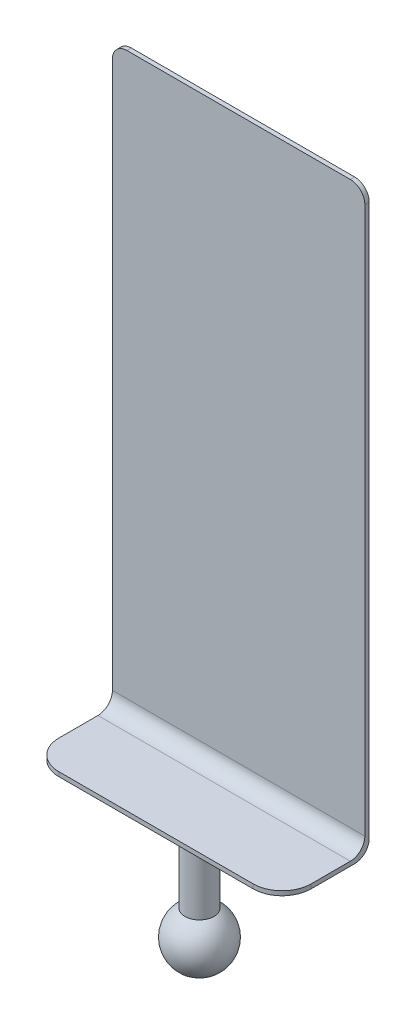
ISO-10303-21;
HEADER;
FILE_DESCRIPTION(('STEP AP214'),'2;1');
FILE_NAME('part.step','',(''),(''),'','','');
FILE_SCHEMA(('AUTOMOTIVE_DESIGN { 1 0 10303 214 1 1 1 1 }'));
ENDSEC;
DATA;
#1=APPLICATION_CONTEXT('core data for automotive mechanical design processes');
#2=APPLICATION_PROTOCOL_DEFINITION('international standard','automotive_design',2000,#1);
#3=PRODUCT_CONTEXT('',#1,'mechanical');
#4=PRODUCT('Part','Part','',(#3));
#5=PRODUCT_RELATED_PRODUCT_CATEGORY('part','',(#4));
#6=PRODUCT_DEFINITION_FORMATION('','',#4);
#7=PRODUCT_DEFINITION_CONTEXT('part definition',#1,'design');
#8=PRODUCT_DEFINITION('design','',#6,#7);
#9=PRODUCT_DEFINITION_SHAPE('','',#8);
#10=(LENGTH_UNIT() NAMED_UNIT(*) SI_UNIT(.MILLI.,.METRE.));
#11=(NAMED_UNIT(*) PLANE_ANGLE_UNIT() SI_UNIT($,.RADIAN.));
#12=(NAMED_UNIT(*) SI_UNIT($,.STERADIAN.) SOLID_ANGLE_UNIT());
#13=UNCERTAINTY_MEASURE_WITH_UNIT(LENGTH_MEASURE(1.E-05),#10,'distance_accuracy_value','');
#14=(GEOMETRIC_REPRESENTATION_CONTEXT(3) GLOBAL_UNCERTAINTY_ASSIGNED_CONTEXT((#13)) GLOBAL_UNIT_ASSIGNED_CONTEXT((#10,
#11,#12)) REPRESENTATION_CONTEXT('',''));
#15=CARTESIAN_POINT('',(0.,0.,0.));
#16=DIRECTION('',(0.,0.,1.));
#17=DIRECTION('',(1.,0.,0.));
#18=AXIS2_PLACEMENT_3D('',#15,#16,#17);
#19=CARTESIAN_POINT('',(43.5,200.,0.749999999999995));
#20=DIRECTION('',(0.,0.,-1.));
#21=DIRECTION('',(-1.,0.,0.));
#22=AXIS2_PLACEMENT_3D('',#19,#20,#21);
#23=PLANE('',#22);
#24=DIRECTION('',(0.,-1.,0.));
#25=VECTOR('',#24,1.);
#26=CARTESIAN_POINT('',(43.5,200.,0.749999999999995));
#27=LINE('',#26,#25);
#28=CARTESIAN_POINT('',(43.5,195.,0.749999999999995));
#29=VERTEX_POINT('',#28);
#30=CARTESIAN_POINT('',(43.5,6.50000000000001,0.749999999999995));
#31=VERTEX_POINT('',#30);
#32=EDGE_CURVE('E166',#29,#31,#27,.T.);
#33=ORIENTED_EDGE('',*,*,#32,.F.);
#34=CARTESIAN_POINT('',(38.5,195.,0.749999999999995));
#35=DIRECTION('',(0.,0.,-1.));
#36=DIRECTION('',(-1.,0.,0.));
#37=AXIS2_PLACEMENT_3D('',#34,#35,#36);
#38=CIRCLE('',#37,5.);
#39=CARTESIAN_POINT('',(38.5,200.,0.749999999999995));
#40=VERTEX_POINT('',#39);
#41=EDGE_CURVE('E219',#29,#40,#38,.F.);
#42=ORIENTED_EDGE('',*,*,#41,.T.);
#43=DIRECTION('',(1.,0.,0.));
#44=VECTOR('',#43,1.);
#45=CARTESIAN_POINT('',(43.5,200.,0.749999999999995));
#46=LINE('',#45,#44);
#47=CARTESIAN_POINT('',(-38.5,200.,0.750000000000005));
#48=VERTEX_POINT('',#47);
#49=EDGE_CURVE('E276',#48,#40,#46,.T.);
#50=ORIENTED_EDGE('',*,*,#49,.F.);
#51=CARTESIAN_POINT('',(-38.5,195.,0.750000000000005));
#52=DIRECTION('',(0.,0.,-1.));
#53=DIRECTION('',(-1.,0.,0.));
#54=AXIS2_PLACEMENT_3D('',#51,#52,#53);
#55=CIRCLE('',#54,5.);
#56=CARTESIAN_POINT('',(-43.5,195.,0.750000000000005));
#57=VERTEX_POINT('',#56);
#58=EDGE_CURVE('E216',#48,#57,#55,.F.);
#59=ORIENTED_EDGE('',*,*,#58,.T.);
#60=DIRECTION('',(0.,-1.,0.));
#61=VECTOR('',#60,1.);
#62=CARTESIAN_POINT('',(-43.5,200.,0.750000000000005));
#63=LINE('',#62,#61);
#64=CARTESIAN_POINT('',(-43.5,6.50000000000001,0.750000000000005));
#65=VERTEX_POINT('',#64);
#66=EDGE_CURVE('E163',#57,#65,#63,.T.);
#67=ORIENTED_EDGE('',*,*,#66,.T.);
#68=DIRECTION('',(-1.,0.,0.));
#69=VECTOR('',#68,1.);
#70=CARTESIAN_POINT('',(43.5,6.5,0.749999999999995));
#71=LINE('',#70,#69);
#72=EDGE_CURVE('E179',#65,#31,#71,.F.);
#73=ORIENTED_EDGE('',*,*,#72,.T.);
#74=EDGE_LOOP('',(#33,#42,#50,#59,#67,#73));
#75=FACE_BOUND('',#74,.T.);
#76=ADVANCED_FACE('F39',(#75),#23,.F.);
#77=CARTESIAN_POINT('',(-43.5,200.,0.750000000000005));
#78=DIRECTION('',(1.,0.,0.));
#79=DIRECTION('',(0.,0.,-1.));
#80=AXIS2_PLACEMENT_3D('',#77,#78,#79);
#81=PLANE('',#80);
#82=DIRECTION('',(0.,0.,1.));
#83=VECTOR('',#82,1.);
#84=CARTESIAN_POINT('',(-43.5,0.,0.750000000000005));
#85=LINE('',#84,#83);
#86=CARTESIAN_POINT('',(-43.5,0.,4.25000000000001));
#87=VERTEX_POINT('',#86);
#88=CARTESIAN_POINT('',(-43.5,0.,19.25));
#89=VERTEX_POINT('',#88);
#90=EDGE_CURVE('E267',#87,#89,#85,.T.);
#91=ORIENTED_EDGE('',*,*,#90,.T.);
#92=DIRECTION('',(0.,-1.,0.));
#93=VECTOR('',#92,1.);
#94=CARTESIAN_POINT('',(-43.5,200.,19.25));
#95=LINE('',#94,#93);
#96=CARTESIAN_POINT('',(-43.5,1.5,19.25));
#97=VERTEX_POINT('',#96);
#98=EDGE_CURVE('E11',#89,#97,#95,.F.);
#99=ORIENTED_EDGE('',*,*,#98,.T.);
#100=DIRECTION('',(0.,0.,-1.));
#101=VECTOR('',#100,1.);
#102=CARTESIAN_POINT('',(-43.5,1.5,29.25));
#103=LINE('',#102,#101);
#104=CARTESIAN_POINT('',(-43.5,1.5,5.75000000000001));
#105=VERTEX_POINT('',#104);
#106=EDGE_CURVE('E268',#97,#105,#103,.T.);
#107=ORIENTED_EDGE('',*,*,#106,.T.);
#108=CARTESIAN_POINT('',(-43.5,6.5,5.75000000000001));
#109=DIRECTION('',(1.,0.,0.));
#110=DIRECTION('',(0.,0.,-1.));
#111=AXIS2_PLACEMENT_3D('',#108,#109,#110);
#112=CIRCLE('',#111,5.);
#113=EDGE_CURVE('E183',#105,#65,#112,.T.);
#114=ORIENTED_EDGE('',*,*,#113,.T.);
#115=ORIENTED_EDGE('',*,*,#66,.F.);
#116=DIRECTION('',(0.,0.,1.));
#117=VECTOR('',#116,1.);
#118=CARTESIAN_POINT('',(-43.5,195.,-0.749999999999995));
#119=LINE('',#118,#117);
#120=CARTESIAN_POINT('',(-43.5,195.,-0.749999999999995));
#121=VERTEX_POINT('',#120);
#122=EDGE_CURVE('E138',#57,#121,#119,.F.);
#123=ORIENTED_EDGE('',*,*,#122,.T.);
#124=DIRECTION('',(0.,-1.,0.));
#125=VECTOR('',#124,1.);
#126=CARTESIAN_POINT('',(-43.5,200.,-0.749999999999995));
#127=LINE('',#126,#125);
#128=CARTESIAN_POINT('',(-43.5,5.,-0.749999999999995));
#129=VERTEX_POINT('',#128);
#130=EDGE_CURVE('E132',#121,#129,#127,.T.);
#131=ORIENTED_EDGE('',*,*,#130,.T.);
#132=CARTESIAN_POINT('',(-43.5,5.,4.25000000000001));
#133=DIRECTION('',(1.,0.,0.));
#134=DIRECTION('',(0.,0.,-1.));
#135=AXIS2_PLACEMENT_3D('',#132,#133,#134);
#136=CIRCLE('',#135,5.);
#137=EDGE_CURVE('E135',#129,#87,#136,.F.);
#138=ORIENTED_EDGE('',*,*,#137,.T.);
#139=EDGE_LOOP('',(#91,#99,#107,#114,#115,#123,#131,#138));
#140=FACE_BOUND('',#139,.T.);
#141=ADVANCED_FACE('F134',(#140),#81,.F.);
#142=CARTESIAN_POINT('',(43.5,200.,0.749999999999995));
#143=DIRECTION('',(-1.,0.,0.));
#144=DIRECTION('',(0.,0.,1.));
#145=AXIS2_PLACEMENT_3D('',#142,#143,#144);
#146=PLANE('',#145);
#147=DIRECTION('',(0.,0.,-1.));
#148=VECTOR('',#147,1.);
#149=CARTESIAN_POINT('',(43.5,1.5,29.25));
#150=LINE('',#149,#148);
#151=CARTESIAN_POINT('',(43.5,1.5,19.25));
#152=VERTEX_POINT('',#151);
#153=CARTESIAN_POINT('',(43.5,1.5,5.75));
#154=VERTEX_POINT('',#153);
#155=EDGE_CURVE('E262',#152,#154,#150,.T.);
#156=ORIENTED_EDGE('',*,*,#155,.F.);
#157=DIRECTION('',(0.,1.,0.));
#158=VECTOR('',#157,1.);
#159=CARTESIAN_POINT('',(43.5,200.,19.25));
#160=LINE('',#159,#158);
#161=CARTESIAN_POINT('',(43.5,0.,19.25));
#162=VERTEX_POINT('',#161);
#163=EDGE_CURVE('E63',#152,#162,#160,.F.);
#164=ORIENTED_EDGE('',*,*,#163,.T.);
#165=DIRECTION('',(0.,0.,-1.));
#166=VECTOR('',#165,1.);
#167=CARTESIAN_POINT('',(43.5,0.,0.749999999999995));
#168=LINE('',#167,#166);
#169=CARTESIAN_POINT('',(43.5,0.,4.24999999999999));
#170=VERTEX_POINT('',#169);
#171=EDGE_CURVE('E247',#162,#170,#168,.T.);
#172=ORIENTED_EDGE('',*,*,#171,.T.);
#173=CARTESIAN_POINT('',(43.5,5.,4.24999999999999));
#174=DIRECTION('',(-1.,0.,0.));
#175=DIRECTION('',(0.,0.,1.));
#176=AXIS2_PLACEMENT_3D('',#173,#174,#175);
#177=CIRCLE('',#176,5.);
#178=CARTESIAN_POINT('',(43.5,5.,-0.750000000000005));
#179=VERTEX_POINT('',#178);
#180=EDGE_CURVE('E172',#170,#179,#177,.F.);
#181=ORIENTED_EDGE('',*,*,#180,.T.);
#182=DIRECTION('',(0.,-1.,0.));
#183=VECTOR('',#182,1.);
#184=CARTESIAN_POINT('',(43.5,200.,-0.750000000000005));
#185=LINE('',#184,#183);
#186=CARTESIAN_POINT('',(43.5,195.,-0.750000000000005));
#187=VERTEX_POINT('',#186);
#188=EDGE_CURVE('E143',#187,#179,#185,.T.);
#189=ORIENTED_EDGE('',*,*,#188,.F.);
#190=DIRECTION('',(0.,0.,-1.));
#191=VECTOR('',#190,1.);
#192=CARTESIAN_POINT('',(43.5,195.,0.749999999999995));
#193=LINE('',#192,#191);
#194=EDGE_CURVE('E213',#187,#29,#193,.F.);
#195=ORIENTED_EDGE('',*,*,#194,.T.);
#196=ORIENTED_EDGE('',*,*,#32,.T.);
#197=CARTESIAN_POINT('',(43.5,6.5,5.74999999999999));
#198=DIRECTION('',(-1.,0.,0.));
#199=DIRECTION('',(0.,0.,1.));
#200=AXIS2_PLACEMENT_3D('',#197,#198,#199);
#201=CIRCLE('',#200,5.);
#202=EDGE_CURVE('E187',#31,#154,#201,.T.);
#203=ORIENTED_EDGE('',*,*,#202,.T.);
#204=EDGE_LOOP('',(#156,#164,#172,#181,#189,#195,#196,#203));
#205=FACE_BOUND('',#204,.T.);
#206=ADVANCED_FACE('F263',(#205),#146,.F.);
#207=CARTESIAN_POINT('',(43.5,200.,-0.750000000000005));
#208=DIRECTION('',(0.,0.,1.));
#209=DIRECTION('',(1.,0.,0.));
#210=AXIS2_PLACEMENT_3D('',#207,#208,#209);
#211=PLANE('',#210);
#212=DIRECTION('',(-1.,0.,0.));
#213=VECTOR('',#212,1.);
#214=CARTESIAN_POINT('',(43.5,200.,-0.750000000000005));
#215=LINE('',#214,#213);
#216=CARTESIAN_POINT('',(38.5,200.,-0.750000000000005));
#217=VERTEX_POINT('',#216);
#218=CARTESIAN_POINT('',(-38.5,200.,-0.749999999999995));
#219=VERTEX_POINT('',#218);
#220=EDGE_CURVE('E144',#217,#219,#215,.T.);
#221=ORIENTED_EDGE('',*,*,#220,.F.);
#222=CARTESIAN_POINT('',(38.5,195.,-0.750000000000005));
#223=DIRECTION('',(0.,0.,1.));
#224=DIRECTION('',(1.,0.,0.));
#225=AXIS2_PLACEMENT_3D('',#222,#223,#224);
#226=CIRCLE('',#225,5.);
#227=EDGE_CURVE('E210',#217,#187,#226,.F.);
#228=ORIENTED_EDGE('',*,*,#227,.T.);
#229=ORIENTED_EDGE('',*,*,#188,.T.);
#230=DIRECTION('',(-1.,0.,0.));
#231=VECTOR('',#230,1.);
#232=CARTESIAN_POINT('',(43.5,5.,-0.750000000000005));
#233=LINE('',#232,#231);
#234=EDGE_CURVE('E151',#179,#129,#233,.T.);
#235=ORIENTED_EDGE('',*,*,#234,.T.);
#236=ORIENTED_EDGE('',*,*,#130,.F.);
#237=CARTESIAN_POINT('',(-38.5,195.,-0.749999999999995));
#238=DIRECTION('',(0.,0.,1.));
#239=DIRECTION('',(1.,0.,0.));
#240=AXIS2_PLACEMENT_3D('',#237,#238,#239);
#241=CIRCLE('',#240,5.);
#242=EDGE_CURVE('E207',#121,#219,#241,.F.);
#243=ORIENTED_EDGE('',*,*,#242,.T.);
#244=EDGE_LOOP('',(#221,#228,#229,#235,#236,#243));
#245=FACE_BOUND('',#244,.T.);
#246=ADVANCED_FACE('F159',(#245),#211,.F.);
#247=CARTESIAN_POINT('',(0.,200.,0.));
#248=DIRECTION('',(0.,1.,0.));
#249=DIRECTION('',(0.,0.,1.));
#250=AXIS2_PLACEMENT_3D('',#247,#248,#249);
#251=PLANE('',#250);
#252=ORIENTED_EDGE('',*,*,#49,.T.);
#253=DIRECTION('',(0.,0.,-1.));
#254=VECTOR('',#253,1.);
#255=CARTESIAN_POINT('',(38.5,200.,-0.750000000000005));
#256=LINE('',#255,#254);
#257=EDGE_CURVE('E203',#40,#217,#256,.T.);
#258=ORIENTED_EDGE('',*,*,#257,.T.);
#259=ORIENTED_EDGE('',*,*,#220,.T.);
#260=DIRECTION('',(0.,0.,1.));
#261=VECTOR('',#260,1.);
#262=CARTESIAN_POINT('',(-38.5,200.,0.750000000000005));
#263=LINE('',#262,#261);
#264=EDGE_CURVE('E199',#219,#48,#263,.T.);
#265=ORIENTED_EDGE('',*,*,#264,.T.);
#266=EDGE_LOOP('',(#252,#258,#259,#265));
#267=FACE_BOUND('',#266,.T.);
#268=ADVANCED_FACE('F306',(#267),#251,.T.);
#269=CARTESIAN_POINT('',(0.,0.,0.));
#270=DIRECTION('',(0.,1.,0.));
#271=DIRECTION('',(0.,0.,1.));
#272=AXIS2_PLACEMENT_3D('',#269,#270,#271);
#273=PLANE('',#272);
#274=ORIENTED_EDGE('',*,*,#171,.F.);
#275=CARTESIAN_POINT('',(33.5,0.,19.25));
#276=DIRECTION('',(0.,1.,0.));
#277=DIRECTION('',(0.,0.,1.));
#278=AXIS2_PLACEMENT_3D('',#275,#276,#277);
#279=CIRCLE('',#278,10.);
#280=CARTESIAN_POINT('',(33.5,0.,29.25));
#281=VERTEX_POINT('',#280);
#282=EDGE_CURVE('E48',#162,#281,#279,.F.);
#283=ORIENTED_EDGE('',*,*,#282,.T.);
#284=DIRECTION('',(1.,0.,0.));
#285=VECTOR('',#284,1.);
#286=CARTESIAN_POINT('',(-43.5,0.,29.25));
#287=LINE('',#286,#285);
#288=CARTESIAN_POINT('',(-33.5,0.,29.25));
#289=VERTEX_POINT('',#288);
#290=EDGE_CURVE('E245',#289,#281,#287,.T.);
#291=ORIENTED_EDGE('',*,*,#290,.F.);
#292=CARTESIAN_POINT('',(-33.5,0.,19.25));
#293=DIRECTION('',(0.,1.,0.));
#294=DIRECTION('',(0.,0.,1.));
#295=AXIS2_PLACEMENT_3D('',#292,#293,#294);
#296=CIRCLE('',#295,10.);
#297=EDGE_CURVE('E55',#289,#89,#296,.F.);
#298=ORIENTED_EDGE('',*,*,#297,.T.);
#299=ORIENTED_EDGE('',*,*,#90,.F.);
#300=DIRECTION('',(-1.,0.,0.));
#301=VECTOR('',#300,1.);
#302=CARTESIAN_POINT('',(0.,0.,4.25));
#303=LINE('',#302,#301);
#304=CARTESIAN_POINT('',(0.,0.,4.25));
#305=VERTEX_POINT('',#304);
#306=EDGE_CURVE('E154',#87,#305,#303,.F.);
#307=ORIENTED_EDGE('',*,*,#306,.T.);
#308=CARTESIAN_POINT('',(0.,0.,14.25));
#309=DIRECTION('',(0.,1.,0.));
#310=DIRECTION('',(0.,0.,1.));
#311=AXIS2_PLACEMENT_3D('',#308,#309,#310);
#312=CIRCLE('',#311,10.0000000000001);
#313=EDGE_CURVE('E195',#305,#305,#312,.T.);
#314=ORIENTED_EDGE('',*,*,#313,.T.);
#315=EDGE_CURVE('E156',#305,#170,#303,.F.);
#316=ORIENTED_EDGE('',*,*,#315,.T.);
#317=EDGE_LOOP('',(#274,#283,#291,#298,#299,#307,#314,#316));
#318=FACE_BOUND('',#317,.T.);
#319=ADVANCED_FACE('F244',(#318),#273,.F.);
#320=CARTESIAN_POINT('',(-43.5,1.5,29.25));
#321=DIRECTION('',(0.,-1.,0.));
#322=DIRECTION('',(1.,0.,0.));
#323=AXIS2_PLACEMENT_3D('',#320,#321,#322);
#324=PLANE('',#323);
#325=DIRECTION('',(-1.,0.,0.));
#326=VECTOR('',#325,1.);
#327=CARTESIAN_POINT('',(-43.5,1.5,29.25));
#328=LINE('',#327,#326);
#329=CARTESIAN_POINT('',(33.5,1.5,29.25));
#330=VERTEX_POINT('',#329);
#331=CARTESIAN_POINT('',(-33.5,1.5,29.25));
#332=VERTEX_POINT('',#331);
#333=EDGE_CURVE('E256',#330,#332,#328,.T.);
#334=ORIENTED_EDGE('',*,*,#333,.F.);
#335=CARTESIAN_POINT('',(33.5,1.5,19.25));
#336=DIRECTION('',(0.,-1.,0.));
#337=DIRECTION('',(1.,0.,0.));
#338=AXIS2_PLACEMENT_3D('',#335,#336,#337);
#339=CIRCLE('',#338,10.);
#340=EDGE_CURVE('E235',#330,#152,#339,.F.);
#341=ORIENTED_EDGE('',*,*,#340,.T.);
#342=ORIENTED_EDGE('',*,*,#155,.T.);
#343=DIRECTION('',(-1.,0.,0.));
#344=VECTOR('',#343,1.);
#345=CARTESIAN_POINT('',(-43.5,1.5,5.75000000000001));
#346=LINE('',#345,#344);
#347=EDGE_CURVE('E175',#154,#105,#346,.T.);
#348=ORIENTED_EDGE('',*,*,#347,.T.);
#349=ORIENTED_EDGE('',*,*,#106,.F.);
#350=CARTESIAN_POINT('',(-33.5,1.5,19.25));
#351=DIRECTION('',(0.,-1.,0.));
#352=DIRECTION('',(1.,0.,0.));
#353=AXIS2_PLACEMENT_3D('',#350,#351,#352);
#354=CIRCLE('',#353,10.);
#355=EDGE_CURVE('E232',#97,#332,#354,.F.);
#356=ORIENTED_EDGE('',*,*,#355,.T.);
#357=EDGE_LOOP('',(#334,#341,#342,#348,#349,#356));
#358=FACE_BOUND('',#357,.T.);
#359=ADVANCED_FACE('F261',(#358),#324,.F.);
#360=CARTESIAN_POINT('',(0.,0.,29.25));
#361=DIRECTION('',(0.,0.,-1.));
#362=DIRECTION('',(-1.,0.,0.));
#363=AXIS2_PLACEMENT_3D('',#360,#361,#362);
#364=PLANE('',#363);
#365=ORIENTED_EDGE('',*,*,#290,.T.);
#366=DIRECTION('',(0.,1.,0.));
#367=VECTOR('',#366,1.);
#368=CARTESIAN_POINT('',(33.5,0.,29.25));
#369=LINE('',#368,#367);
#370=EDGE_CURVE('E228',#281,#330,#369,.T.);
#371=ORIENTED_EDGE('',*,*,#370,.T.);
#372=ORIENTED_EDGE('',*,*,#333,.T.);
#373=DIRECTION('',(0.,-1.,0.));
#374=VECTOR('',#373,1.);
#375=CARTESIAN_POINT('',(-33.5,0.,29.25));
#376=LINE('',#375,#374);
#377=EDGE_CURVE('E224',#332,#289,#376,.T.);
#378=ORIENTED_EDGE('',*,*,#377,.T.);
#379=EDGE_LOOP('',(#365,#371,#372,#378));
#380=FACE_BOUND('',#379,.T.);
#381=ADVANCED_FACE('F251',(#380),#364,.F.);
#382=CARTESIAN_POINT('',(43.5,5.,4.24999999999999));
#383=DIRECTION('',(-1.,0.,0.));
#384=DIRECTION('',(0.,0.,1.));
#385=AXIS2_PLACEMENT_3D('',#382,#383,#384);
#386=CYLINDRICAL_SURFACE('',#385,5.);
#387=ORIENTED_EDGE('',*,*,#180,.F.);
#388=ORIENTED_EDGE('',*,*,#315,.F.);
#389=ORIENTED_EDGE('',*,*,#306,.F.);
#390=ORIENTED_EDGE('',*,*,#137,.F.);
#391=ORIENTED_EDGE('',*,*,#234,.F.);
#392=EDGE_LOOP('',(#387,#388,#389,#390,#391));
#393=FACE_BOUND('',#392,.T.);
#394=ADVANCED_FACE('F150',(#393),#386,.T.);
#395=CARTESIAN_POINT('',(-43.5,6.5,5.75000000000001));
#396=DIRECTION('',(1.,0.,0.));
#397=DIRECTION('',(0.,0.,-1.));
#398=AXIS2_PLACEMENT_3D('',#395,#396,#397);
#399=CYLINDRICAL_SURFACE('',#398,5.);
#400=ORIENTED_EDGE('',*,*,#202,.F.);
#401=ORIENTED_EDGE('',*,*,#72,.F.);
#402=ORIENTED_EDGE('',*,*,#113,.F.);
#403=ORIENTED_EDGE('',*,*,#347,.F.);
#404=EDGE_LOOP('',(#400,#401,#402,#403));
#405=FACE_BOUND('',#404,.T.);
#406=ADVANCED_FACE('F294',(#405),#399,.F.);
#407=CARTESIAN_POINT('',(0.,0.,14.25));
#408=DIRECTION('',(0.,1.,0.));
#409=DIRECTION('',(-1.,0.,0.));
#410=AXIS2_PLACEMENT_3D('',#407,#408,#409);
#411=CYLINDRICAL_SURFACE('',#410,5.00000000000006);
#412=CARTESIAN_POINT('',(0.,-5.,14.25));
#413=DIRECTION('',(0.,1.,0.));
#414=DIRECTION('',(0.,0.,1.));
#415=AXIS2_PLACEMENT_3D('',#412,#413,#414);
#416=CIRCLE('',#415,5.00000000000006);
#417=CARTESIAN_POINT('',(0.,-5.,19.2500000000001));
#418=VERTEX_POINT('',#417);
#419=EDGE_CURVE('E191',#418,#418,#416,.F.);
#420=ORIENTED_EDGE('',*,*,#419,.T.);
#421=EDGE_LOOP('',(#420));
#422=FACE_BOUND('',#421,.T.);
#423=CARTESIAN_POINT('',(0.,-30.,14.25));
#424=DIRECTION('',(0.,1.,0.));
#425=DIRECTION('',(-1.,0.,0.));
#426=AXIS2_PLACEMENT_3D('',#423,#424,#425);
#427=CIRCLE('',#426,5.00000000000004);
#428=CARTESIAN_POINT('',(-5.00000000000008,-30.,14.25));
#429=VERTEX_POINT('',#428);
#430=EDGE_CURVE('E257',#429,#429,#427,.T.);
#431=ORIENTED_EDGE('',*,*,#430,.T.);
#432=EDGE_LOOP('',(#431));
#433=FACE_BOUND('',#432,.T.);
#434=ADVANCED_FACE('F331',(#422,#433),#411,.T.);
#435=CARTESIAN_POINT('',(0.,-38.6602540378444,14.25));
#436=DIRECTION('',(0.,1.,0.));
#437=DIRECTION('',(-1.,0.,0.));
#438=AXIS2_PLACEMENT_3D('',#435,#436,#437);
#439=SPHERICAL_SURFACE('',#438,10.);
#440=ORIENTED_EDGE('',*,*,#430,.F.);
#441=EDGE_LOOP('',(#440));
#442=FACE_BOUND('',#441,.T.);
#443=ADVANCED_FACE('F333',(#442),#439,.T.);
#444=CARTESIAN_POINT('',(0.,-5.,14.25));
#445=DIRECTION('',(0.,1.,0.));
#446=DIRECTION('',(0.,0.,1.));
#447=AXIS2_PLACEMENT_3D('',#444,#445,#446);
#448=TOROIDAL_SURFACE('',#447,10.0000000000001,5.);
#449=ORIENTED_EDGE('',*,*,#313,.F.);
#450=EDGE_LOOP('',(#449));
#451=FACE_BOUND('',#450,.T.);
#452=ORIENTED_EDGE('',*,*,#419,.F.);
#453=EDGE_LOOP('',(#452));
#454=FACE_BOUND('',#453,.T.);
#455=ADVANCED_FACE('F316',(#451,#454),#448,.F.);
#456=CARTESIAN_POINT('',(38.5,195.,0.));
#457=DIRECTION('',(0.,0.,1.));
#458=DIRECTION('',(1.,0.,0.));
#459=AXIS2_PLACEMENT_3D('',#456,#457,#458);
#460=CYLINDRICAL_SURFACE('',#459,5.);
#461=ORIENTED_EDGE('',*,*,#41,.F.);
#462=ORIENTED_EDGE('',*,*,#194,.F.);
#463=ORIENTED_EDGE('',*,*,#227,.F.);
#464=ORIENTED_EDGE('',*,*,#257,.F.);
#465=EDGE_LOOP('',(#461,#462,#463,#464));
#466=FACE_BOUND('',#465,.T.);
#467=ADVANCED_FACE('F302',(#466),#460,.T.);
#468=CARTESIAN_POINT('',(-38.5,195.,0.));
#469=DIRECTION('',(0.,0.,-1.));
#470=DIRECTION('',(-1.,0.,0.));
#471=AXIS2_PLACEMENT_3D('',#468,#469,#470);
#472=CYLINDRICAL_SURFACE('',#471,5.);
#473=ORIENTED_EDGE('',*,*,#242,.F.);
#474=ORIENTED_EDGE('',*,*,#122,.F.);
#475=ORIENTED_EDGE('',*,*,#58,.F.);
#476=ORIENTED_EDGE('',*,*,#264,.F.);
#477=EDGE_LOOP('',(#473,#474,#475,#476));
#478=FACE_BOUND('',#477,.T.);
#479=ADVANCED_FACE('F309',(#478),#472,.T.);
#480=CARTESIAN_POINT('',(33.5,0.,19.25));
#481=DIRECTION('',(0.,1.,0.));
#482=DIRECTION('',(0.,0.,1.));
#483=AXIS2_PLACEMENT_3D('',#480,#481,#482);
#484=CYLINDRICAL_SURFACE('',#483,10.);
#485=ORIENTED_EDGE('',*,*,#282,.F.);
#486=ORIENTED_EDGE('',*,*,#163,.F.);
#487=ORIENTED_EDGE('',*,*,#340,.F.);
#488=ORIENTED_EDGE('',*,*,#370,.F.);
#489=EDGE_LOOP('',(#485,#486,#487,#488));
#490=FACE_BOUND('',#489,.T.);
#491=ADVANCED_FACE('F259',(#490),#484,.T.);
#492=CARTESIAN_POINT('',(-33.5,0.,19.25));
#493=DIRECTION('',(0.,-1.,0.));
#494=DIRECTION('',(0.,0.,-1.));
#495=AXIS2_PLACEMENT_3D('',#492,#493,#494);
#496=CYLINDRICAL_SURFACE('',#495,10.);
#497=ORIENTED_EDGE('',*,*,#355,.F.);
#498=ORIENTED_EDGE('',*,*,#98,.F.);
#499=ORIENTED_EDGE('',*,*,#297,.F.);
#500=ORIENTED_EDGE('',*,*,#377,.F.);
#501=EDGE_LOOP('',(#497,#498,#499,#500));
#502=FACE_BOUND('',#501,.T.);
#503=ADVANCED_FACE('F41',(#502),#496,.T.);
#504=CLOSED_SHELL('',(#76,#141,#206,#246,#268,#319,#359,#381,#394,#406,#434,#443,#455,#467,#479,
#491,#503));
#505=MANIFOLD_SOLID_BREP('B2',#504);
#506=ADVANCED_BREP_SHAPE_REPRESENTATION('',(#18,#505),#14);
#507=SHAPE_DEFINITION_REPRESENTATION(#9,#506);
ENDSEC;
END-ISO-10303-21;
